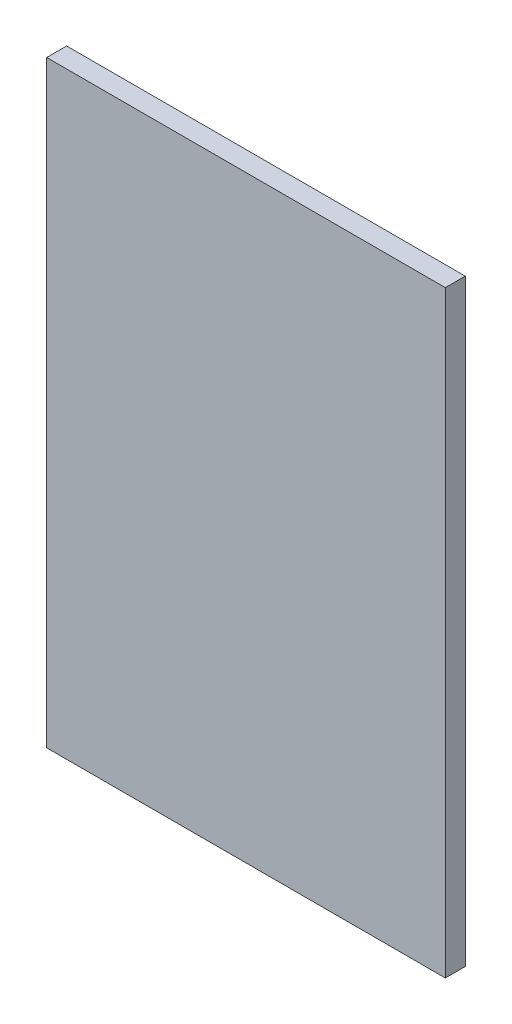
ISO-10303-21;
HEADER;
FILE_DESCRIPTION(('STEP AP214'),'2;1');
FILE_NAME('part.step','',(''),(''),'','','');
FILE_SCHEMA(('AUTOMOTIVE_DESIGN { 1 0 10303 214 1 1 1 1 }'));
ENDSEC;
DATA;
#1=APPLICATION_CONTEXT('core data for automotive mechanical design processes');
#2=APPLICATION_PROTOCOL_DEFINITION('international standard','automotive_design',2000,#1);
#3=PRODUCT_CONTEXT('',#1,'mechanical');
#4=PRODUCT('Part','Part','',(#3));
#5=PRODUCT_RELATED_PRODUCT_CATEGORY('part','',(#4));
#6=PRODUCT_DEFINITION_FORMATION('','',#4);
#7=PRODUCT_DEFINITION_CONTEXT('part definition',#1,'design');
#8=PRODUCT_DEFINITION('design','',#6,#7);
#9=PRODUCT_DEFINITION_SHAPE('','',#8);
#10=(LENGTH_UNIT() NAMED_UNIT(*) SI_UNIT(.MILLI.,.METRE.));
#11=(NAMED_UNIT(*) PLANE_ANGLE_UNIT() SI_UNIT($,.RADIAN.));
#12=(NAMED_UNIT(*) SI_UNIT($,.STERADIAN.) SOLID_ANGLE_UNIT());
#13=UNCERTAINTY_MEASURE_WITH_UNIT(LENGTH_MEASURE(1.E-05),#10,'distance_accuracy_value','');
#14=(GEOMETRIC_REPRESENTATION_CONTEXT(3) GLOBAL_UNCERTAINTY_ASSIGNED_CONTEXT((#13)) GLOBAL_UNIT_ASSIGNED_CONTEXT((#10,
#11,#12)) REPRESENTATION_CONTEXT('',''));
#15=CARTESIAN_POINT('',(0.,0.,0.));
#16=DIRECTION('',(0.,0.,1.));
#17=DIRECTION('',(1.,0.,0.));
#18=AXIS2_PLACEMENT_3D('',#15,#16,#17);
#19=CARTESIAN_POINT('',(45.660998535156,48.689997558594,1.1723000001));
#20=DIRECTION('',(0.,0.,1.));
#21=DIRECTION('',(1.,0.,0.));
#22=AXIS2_PLACEMENT_3D('',#19,#20,#21);
#23=PLANE('',#22);
#24=DIRECTION('',(0.,1.,0.));
#25=VECTOR('',#24,1.);
#26=CARTESIAN_POINT('',(45.787998046875,48.880498046875,1.1723000001));
#27=LINE('',#26,#25);
#28=CARTESIAN_POINT('',(45.787998046875,48.499497070312,1.1723000001));
#29=VERTEX_POINT('',#28);
#30=CARTESIAN_POINT('',(45.787998046875,48.880498046875,1.1723000001));
#31=VERTEX_POINT('',#30);
#32=EDGE_CURVE('E28',#29,#31,#27,.T.);
#33=ORIENTED_EDGE('',*,*,#32,.T.);
#34=DIRECTION('',(-1.,0.,0.));
#35=VECTOR('',#34,1.);
#36=CARTESIAN_POINT('',(45.533999023438,48.880498046875,1.1723000001));
#37=LINE('',#36,#35);
#38=CARTESIAN_POINT('',(45.533999023438,48.880498046875,1.1723000001));
#39=VERTEX_POINT('',#38);
#40=EDGE_CURVE('E61',#31,#39,#37,.T.);
#41=ORIENTED_EDGE('',*,*,#40,.T.);
#42=DIRECTION('',(0.,-1.,0.));
#43=VECTOR('',#42,1.);
#44=CARTESIAN_POINT('',(45.533999023438,48.499497070312,1.1723000001));
#45=LINE('',#44,#43);
#46=CARTESIAN_POINT('',(45.533999023438,48.499497070312,1.1723000001));
#47=VERTEX_POINT('',#46);
#48=EDGE_CURVE('E73',#39,#47,#45,.T.);
#49=ORIENTED_EDGE('',*,*,#48,.T.);
#50=DIRECTION('',(1.,0.,0.));
#51=VECTOR('',#50,1.);
#52=CARTESIAN_POINT('',(45.787998046875,48.499497070312,1.1723000001));
#53=LINE('',#52,#51);
#54=EDGE_CURVE('E11',#47,#29,#53,.T.);
#55=ORIENTED_EDGE('',*,*,#54,.T.);
#56=EDGE_LOOP('',(#33,#41,#49,#55));
#57=FACE_BOUND('',#56,.T.);
#58=ADVANCED_FACE('F17',(#57),#23,.T.);
#59=CARTESIAN_POINT('',(45.787998046875,48.499497070312,1.1596000001));
#60=DIRECTION('',(0.,1.,0.));
#61=DIRECTION('',(1.,0.,0.));
#62=AXIS2_PLACEMENT_3D('',#59,#60,#61);
#63=PLANE('',#62);
#64=DIRECTION('',(0.,0.,-1.));
#65=VECTOR('',#64,1.);
#66=CARTESIAN_POINT('',(45.533999023438,48.499497070312,1.1596000001));
#67=LINE('',#66,#65);
#68=CARTESIAN_POINT('',(45.533999023438,48.499497070312,1.1596000001));
#69=VERTEX_POINT('',#68);
#70=EDGE_CURVE('E70',#47,#69,#67,.T.);
#71=ORIENTED_EDGE('',*,*,#70,.T.);
#72=DIRECTION('',(1.,0.,0.));
#73=VECTOR('',#72,1.);
#74=CARTESIAN_POINT('',(45.660998535156,48.499497070312,1.1596000001));
#75=LINE('',#74,#73);
#76=CARTESIAN_POINT('',(45.787998046875,48.499497070312,1.1596000001));
#77=VERTEX_POINT('',#76);
#78=EDGE_CURVE('E99',#69,#77,#75,.T.);
#79=ORIENTED_EDGE('',*,*,#78,.T.);
#80=DIRECTION('',(0.,0.,1.));
#81=VECTOR('',#80,1.);
#82=CARTESIAN_POINT('',(45.787998046875,48.499497070312,1.1596000001));
#83=LINE('',#82,#81);
#84=EDGE_CURVE('E72',#77,#29,#83,.T.);
#85=ORIENTED_EDGE('',*,*,#84,.T.);
#86=ORIENTED_EDGE('',*,*,#54,.F.);
#87=EDGE_LOOP('',(#71,#79,#85,#86));
#88=FACE_BOUND('',#87,.T.);
#89=ADVANCED_FACE('F67',(#88),#63,.F.);
#90=CARTESIAN_POINT('',(45.787998046875,48.880498046875,1.1596000001));
#91=DIRECTION('',(-1.,0.,0.));
#92=DIRECTION('',(0.,0.,1.));
#93=AXIS2_PLACEMENT_3D('',#90,#91,#92);
#94=PLANE('',#93);
#95=ORIENTED_EDGE('',*,*,#84,.F.);
#96=DIRECTION('',(0.,1.,0.));
#97=VECTOR('',#96,1.);
#98=CARTESIAN_POINT('',(45.787998046875,48.689997558594,1.1596000001));
#99=LINE('',#98,#97);
#100=CARTESIAN_POINT('',(45.787998046875,48.880498046875,1.1596000001));
#101=VERTEX_POINT('',#100);
#102=EDGE_CURVE('E95',#77,#101,#99,.T.);
#103=ORIENTED_EDGE('',*,*,#102,.T.);
#104=DIRECTION('',(0.,0.,1.));
#105=VECTOR('',#104,1.);
#106=CARTESIAN_POINT('',(45.787998046875,48.880498046875,1.1596000001));
#107=LINE('',#106,#105);
#108=EDGE_CURVE('E21',#101,#31,#107,.T.);
#109=ORIENTED_EDGE('',*,*,#108,.T.);
#110=ORIENTED_EDGE('',*,*,#32,.F.);
#111=EDGE_LOOP('',(#95,#103,#109,#110));
#112=FACE_BOUND('',#111,.T.);
#113=ADVANCED_FACE('F149',(#112),#94,.F.);
#114=CARTESIAN_POINT('',(45.533999023438,48.880498046875,1.1596000001));
#115=DIRECTION('',(0.,-1.,0.));
#116=DIRECTION('',(0.,0.,-1.));
#117=AXIS2_PLACEMENT_3D('',#114,#115,#116);
#118=PLANE('',#117);
#119=ORIENTED_EDGE('',*,*,#108,.F.);
#120=DIRECTION('',(-1.,0.,0.));
#121=VECTOR('',#120,1.);
#122=CARTESIAN_POINT('',(45.660998535156,48.880498046875,1.1596000001));
#123=LINE('',#122,#121);
#124=CARTESIAN_POINT('',(45.533999023438,48.880498046875,1.1596000001));
#125=VERTEX_POINT('',#124);
#126=EDGE_CURVE('E92',#101,#125,#123,.T.);
#127=ORIENTED_EDGE('',*,*,#126,.T.);
#128=DIRECTION('',(0.,0.,1.));
#129=VECTOR('',#128,1.);
#130=CARTESIAN_POINT('',(45.533999023438,48.880498046875,1.1596000001));
#131=LINE('',#130,#129);
#132=EDGE_CURVE('E83',#125,#39,#131,.T.);
#133=ORIENTED_EDGE('',*,*,#132,.T.);
#134=ORIENTED_EDGE('',*,*,#40,.F.);
#135=EDGE_LOOP('',(#119,#127,#133,#134));
#136=FACE_BOUND('',#135,.T.);
#137=ADVANCED_FACE('F19',(#136),#118,.F.);
#138=CARTESIAN_POINT('',(45.533999023438,48.499497070312,1.1596000001));
#139=DIRECTION('',(1.,0.,0.));
#140=DIRECTION('',(0.,1.,0.));
#141=AXIS2_PLACEMENT_3D('',#138,#139,#140);
#142=PLANE('',#141);
#143=ORIENTED_EDGE('',*,*,#132,.F.);
#144=DIRECTION('',(0.,-1.,0.));
#145=VECTOR('',#144,1.);
#146=CARTESIAN_POINT('',(45.533999023438,48.689997558594,1.1596000001));
#147=LINE('',#146,#145);
#148=EDGE_CURVE('E80',#125,#69,#147,.T.);
#149=ORIENTED_EDGE('',*,*,#148,.T.);
#150=ORIENTED_EDGE('',*,*,#70,.F.);
#151=ORIENTED_EDGE('',*,*,#48,.F.);
#152=EDGE_LOOP('',(#143,#149,#150,#151));
#153=FACE_BOUND('',#152,.T.);
#154=ADVANCED_FACE('F78',(#153),#142,.F.);
#155=CARTESIAN_POINT('',(45.660998535156,48.689997558594,1.1596000001));
#156=DIRECTION('',(0.,0.,1.));
#157=DIRECTION('',(1.,0.,0.));
#158=AXIS2_PLACEMENT_3D('',#155,#156,#157);
#159=PLANE('',#158);
#160=ORIENTED_EDGE('',*,*,#126,.F.);
#161=ORIENTED_EDGE('',*,*,#102,.F.);
#162=ORIENTED_EDGE('',*,*,#78,.F.);
#163=ORIENTED_EDGE('',*,*,#148,.F.);
#164=EDGE_LOOP('',(#160,#161,#162,#163));
#165=FACE_BOUND('',#164,.T.);
#166=ADVANCED_FACE('F159',(#165),#159,.F.);
#167=CLOSED_SHELL('',(#58,#89,#113,#137,#154,#166));
#168=MANIFOLD_SOLID_BREP('B1',#167);
#169=ADVANCED_BREP_SHAPE_REPRESENTATION('',(#18,#168),#14);
#170=SHAPE_DEFINITION_REPRESENTATION(#9,#169);
ENDSEC;
END-ISO-10303-21;
